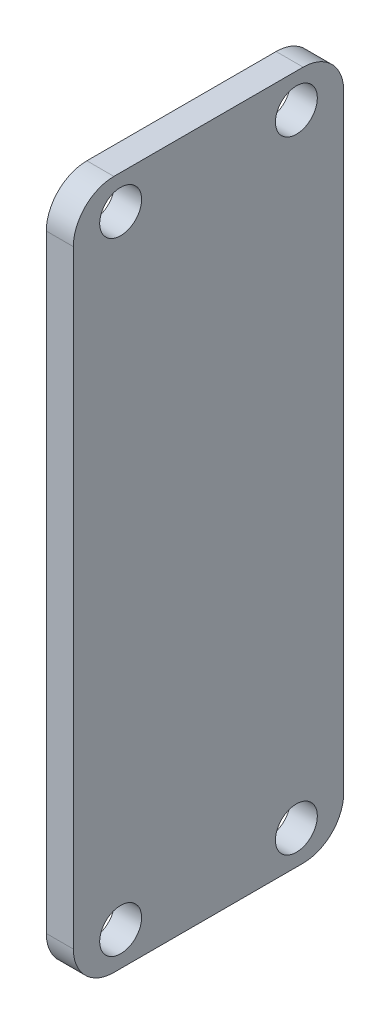
ISO-10303-21;
HEADER;
FILE_DESCRIPTION(('STEP AP214'),'2;1');
FILE_NAME('part.step','',(''),(''),'','','');
FILE_SCHEMA(('AUTOMOTIVE_DESIGN { 1 0 10303 214 1 1 1 1 }'));
ENDSEC;
DATA;
#1=APPLICATION_CONTEXT('core data for automotive mechanical design processes');
#2=APPLICATION_PROTOCOL_DEFINITION('international standard','automotive_design',2000,#1);
#3=PRODUCT_CONTEXT('',#1,'mechanical');
#4=PRODUCT('Part','Part','',(#3));
#5=PRODUCT_RELATED_PRODUCT_CATEGORY('part','',(#4));
#6=PRODUCT_DEFINITION_FORMATION('','',#4);
#7=PRODUCT_DEFINITION_CONTEXT('part definition',#1,'design');
#8=PRODUCT_DEFINITION('design','',#6,#7);
#9=PRODUCT_DEFINITION_SHAPE('','',#8);
#10=(LENGTH_UNIT() NAMED_UNIT(*) SI_UNIT(.MILLI.,.METRE.));
#11=(NAMED_UNIT(*) PLANE_ANGLE_UNIT() SI_UNIT($,.RADIAN.));
#12=(NAMED_UNIT(*) SI_UNIT($,.STERADIAN.) SOLID_ANGLE_UNIT());
#13=UNCERTAINTY_MEASURE_WITH_UNIT(LENGTH_MEASURE(1.E-05),#10,'distance_accuracy_value','');
#14=(GEOMETRIC_REPRESENTATION_CONTEXT(3) GLOBAL_UNCERTAINTY_ASSIGNED_CONTEXT((#13)) GLOBAL_UNIT_ASSIGNED_CONTEXT((#10,
#11,#12)) REPRESENTATION_CONTEXT('',''));
#15=CARTESIAN_POINT('',(0.,0.,0.));
#16=DIRECTION('',(0.,0.,1.));
#17=DIRECTION('',(1.,0.,0.));
#18=AXIS2_PLACEMENT_3D('',#15,#16,#17);
#19=CARTESIAN_POINT('',(0.,25.5,-9.5));
#20=DIRECTION('',(-1.,0.,0.));
#21=DIRECTION('',(0.,0.,1.));
#22=AXIS2_PLACEMENT_3D('',#19,#20,#21);
#23=PLANE('',#22);
#24=CARTESIAN_POINT('',(0.,-22.5,4.49999999999996));
#25=DIRECTION('',(-1.,0.,0.));
#26=DIRECTION('',(0.,0.,1.));
#27=AXIS2_PLACEMENT_3D('',#24,#25,#26);
#28=CIRCLE('',#27,3.);
#29=CARTESIAN_POINT('',(0.,-25.5,4.49999999999996));
#30=VERTEX_POINT('',#29);
#31=CARTESIAN_POINT('',(0.,-22.5,7.5));
#32=VERTEX_POINT('',#31);
#33=EDGE_CURVE('E118',#30,#32,#28,.T.);
#34=ORIENTED_EDGE('',*,*,#33,.T.);
#35=DIRECTION('',(0.,-1.,0.));
#36=VECTOR('',#35,1.);
#37=CARTESIAN_POINT('',(0.,25.5,7.50000000000001));
#38=LINE('',#37,#36);
#39=CARTESIAN_POINT('',(0.,22.5,7.5));
#40=VERTEX_POINT('',#39);
#41=EDGE_CURVE('E12',#40,#32,#38,.T.);
#42=ORIENTED_EDGE('',*,*,#41,.F.);
#43=CARTESIAN_POINT('',(0.,22.5,4.50000000000004));
#44=DIRECTION('',(-1.,0.,0.));
#45=DIRECTION('',(0.,0.,1.));
#46=AXIS2_PLACEMENT_3D('',#43,#44,#45);
#47=CIRCLE('',#46,3.);
#48=CARTESIAN_POINT('',(0.,25.5,4.50000000000004));
#49=VERTEX_POINT('',#48);
#50=EDGE_CURVE('E124',#40,#49,#47,.T.);
#51=ORIENTED_EDGE('',*,*,#50,.T.);
#52=DIRECTION('',(0.,0.,-1.));
#53=VECTOR('',#52,1.);
#54=CARTESIAN_POINT('',(0.,25.5,0.));
#55=LINE('',#54,#53);
#56=CARTESIAN_POINT('',(0.,25.5,-9.5));
#57=VERTEX_POINT('',#56);
#58=EDGE_CURVE('E152',#49,#57,#55,.T.);
#59=ORIENTED_EDGE('',*,*,#58,.T.);
#60=CARTESIAN_POINT('',(0.,22.5,-9.5));
#61=DIRECTION('',(-1.,0.,0.));
#62=DIRECTION('',(0.,0.,1.));
#63=AXIS2_PLACEMENT_3D('',#60,#61,#62);
#64=CIRCLE('',#63,3.);
#65=CARTESIAN_POINT('',(0.,22.5,-12.5));
#66=VERTEX_POINT('',#65);
#67=EDGE_CURVE('E128',#57,#66,#64,.T.);
#68=ORIENTED_EDGE('',*,*,#67,.T.);
#69=DIRECTION('',(0.,1.,0.));
#70=VECTOR('',#69,1.);
#71=CARTESIAN_POINT('',(0.,0.,-12.5));
#72=LINE('',#71,#70);
#73=CARTESIAN_POINT('',(0.,-22.5,-12.5));
#74=VERTEX_POINT('',#73);
#75=EDGE_CURVE('E159',#74,#66,#72,.T.);
#76=ORIENTED_EDGE('',*,*,#75,.F.);
#77=CARTESIAN_POINT('',(0.,-22.5,-9.5));
#78=DIRECTION('',(-1.,0.,0.));
#79=DIRECTION('',(0.,0.,1.));
#80=AXIS2_PLACEMENT_3D('',#77,#78,#79);
#81=CIRCLE('',#80,3.);
#82=CARTESIAN_POINT('',(0.,-25.5,-9.5));
#83=VERTEX_POINT('',#82);
#84=EDGE_CURVE('E123',#74,#83,#81,.T.);
#85=ORIENTED_EDGE('',*,*,#84,.T.);
#86=DIRECTION('',(0.,0.,-1.));
#87=VECTOR('',#86,1.);
#88=CARTESIAN_POINT('',(0.,-25.5,0.));
#89=LINE('',#88,#87);
#90=EDGE_CURVE('E49',#30,#83,#89,.T.);
#91=ORIENTED_EDGE('',*,*,#90,.F.);
#92=EDGE_LOOP('',(#34,#42,#51,#59,#68,#76,#85,#91));
#93=FACE_BOUND('',#92,.T.);
#94=CARTESIAN_POINT('',(0.,23.,4.00000000000001));
#95=DIRECTION('',(-1.,0.,0.));
#96=DIRECTION('',(0.,0.,1.));
#97=AXIS2_PLACEMENT_3D('',#94,#95,#96);
#98=CIRCLE('',#97,1.55);
#99=CARTESIAN_POINT('',(0.,23.,5.55000000000001));
#100=VERTEX_POINT('',#99);
#101=EDGE_CURVE('E164',#100,#100,#98,.F.);
#102=ORIENTED_EDGE('',*,*,#101,.T.);
#103=EDGE_LOOP('',(#102));
#104=FACE_BOUND('',#103,.T.);
#105=CARTESIAN_POINT('',(0.,23.,-9.));
#106=DIRECTION('',(-1.,0.,0.));
#107=DIRECTION('',(0.,0.,1.));
#108=AXIS2_PLACEMENT_3D('',#105,#106,#107);
#109=CIRCLE('',#108,1.55);
#110=CARTESIAN_POINT('',(0.,23.,-7.45));
#111=VERTEX_POINT('',#110);
#112=EDGE_CURVE('E156',#111,#111,#109,.F.);
#113=ORIENTED_EDGE('',*,*,#112,.T.);
#114=EDGE_LOOP('',(#113));
#115=FACE_BOUND('',#114,.T.);
#116=CARTESIAN_POINT('',(0.,-23.,-9.));
#117=DIRECTION('',(-1.,0.,0.));
#118=DIRECTION('',(0.,0.,1.));
#119=AXIS2_PLACEMENT_3D('',#116,#117,#118);
#120=CIRCLE('',#119,1.55);
#121=CARTESIAN_POINT('',(0.,-23.,-7.45));
#122=VERTEX_POINT('',#121);
#123=EDGE_CURVE('E151',#122,#122,#120,.F.);
#124=ORIENTED_EDGE('',*,*,#123,.T.);
#125=EDGE_LOOP('',(#124));
#126=FACE_BOUND('',#125,.T.);
#127=CARTESIAN_POINT('',(0.,-23.,4.));
#128=DIRECTION('',(-1.,0.,0.));
#129=DIRECTION('',(0.,0.,1.));
#130=AXIS2_PLACEMENT_3D('',#127,#128,#129);
#131=CIRCLE('',#130,1.55);
#132=CARTESIAN_POINT('',(0.,-23.,5.55));
#133=VERTEX_POINT('',#132);
#134=EDGE_CURVE('E155',#133,#133,#131,.F.);
#135=ORIENTED_EDGE('',*,*,#134,.T.);
#136=EDGE_LOOP('',(#135));
#137=FACE_BOUND('',#136,.T.);
#138=ADVANCED_FACE('F41',(#93,#104,#115,#126,#137),#23,.T.);
#139=CARTESIAN_POINT('',(-54.7813836992094,25.5,0.));
#140=DIRECTION('',(0.,-1.,0.));
#141=DIRECTION('',(0.,0.,-1.));
#142=AXIS2_PLACEMENT_3D('',#139,#140,#141);
#143=PLANE('',#142);
#144=DIRECTION('',(0.,0.,-1.));
#145=VECTOR('',#144,1.);
#146=CARTESIAN_POINT('',(2.,25.5,0.));
#147=LINE('',#146,#145);
#148=CARTESIAN_POINT('',(2.,25.5,4.50000000000004));
#149=VERTEX_POINT('',#148);
#150=CARTESIAN_POINT('',(2.,25.5,-9.5));
#151=VERTEX_POINT('',#150);
#152=EDGE_CURVE('E158',#149,#151,#147,.T.);
#153=ORIENTED_EDGE('',*,*,#152,.T.);
#154=DIRECTION('',(1.,0.,0.));
#155=VECTOR('',#154,1.);
#156=CARTESIAN_POINT('',(0.,25.5,-9.5));
#157=LINE('',#156,#155);
#158=EDGE_CURVE('E137',#151,#57,#157,.F.);
#159=ORIENTED_EDGE('',*,*,#158,.T.);
#160=ORIENTED_EDGE('',*,*,#58,.F.);
#161=DIRECTION('',(1.,0.,0.));
#162=VECTOR('',#161,1.);
#163=CARTESIAN_POINT('',(-54.7813836992094,25.5,4.50000000000004));
#164=LINE('',#163,#162);
#165=EDGE_CURVE('E139',#49,#149,#164,.T.);
#166=ORIENTED_EDGE('',*,*,#165,.T.);
#167=EDGE_LOOP('',(#153,#159,#160,#166));
#168=FACE_BOUND('',#167,.T.);
#169=ADVANCED_FACE('F213',(#168),#143,.F.);
#170=CARTESIAN_POINT('',(-16.,4.54999999999999,7.50000000000001));
#171=DIRECTION('',(0.,0.,-1.));
#172=DIRECTION('',(0.,1.,0.));
#173=AXIS2_PLACEMENT_3D('',#170,#171,#172);
#174=PLANE('',#173);
#175=ORIENTED_EDGE('',*,*,#41,.T.);
#176=DIRECTION('',(1.,0.,0.));
#177=VECTOR('',#176,1.);
#178=CARTESIAN_POINT('',(2.,-22.5,7.49999999999997));
#179=LINE('',#178,#177);
#180=CARTESIAN_POINT('',(2.,-22.5,7.5));
#181=VERTEX_POINT('',#180);
#182=EDGE_CURVE('E110',#32,#181,#179,.T.);
#183=ORIENTED_EDGE('',*,*,#182,.T.);
#184=DIRECTION('',(0.,-1.,0.));
#185=VECTOR('',#184,1.);
#186=CARTESIAN_POINT('',(2.,0.,7.5));
#187=LINE('',#186,#185);
#188=CARTESIAN_POINT('',(2.,22.5,7.5));
#189=VERTEX_POINT('',#188);
#190=EDGE_CURVE('E167',#189,#181,#187,.T.);
#191=ORIENTED_EDGE('',*,*,#190,.F.);
#192=DIRECTION('',(1.,0.,0.));
#193=VECTOR('',#192,1.);
#194=CARTESIAN_POINT('',(-16.,22.5,7.50000000000004));
#195=LINE('',#194,#193);
#196=EDGE_CURVE('E113',#189,#40,#195,.F.);
#197=ORIENTED_EDGE('',*,*,#196,.T.);
#198=EDGE_LOOP('',(#175,#183,#191,#197));
#199=FACE_BOUND('',#198,.T.);
#200=ADVANCED_FACE('F43',(#199),#174,.F.);
#201=CARTESIAN_POINT('',(-54.7813836992094,-25.5,0.));
#202=DIRECTION('',(0.,-1.,0.));
#203=DIRECTION('',(0.,0.,-1.));
#204=AXIS2_PLACEMENT_3D('',#201,#202,#203);
#205=PLANE('',#204);
#206=DIRECTION('',(0.,0.,-1.));
#207=VECTOR('',#206,1.);
#208=CARTESIAN_POINT('',(2.,-25.5,0.));
#209=LINE('',#208,#207);
#210=CARTESIAN_POINT('',(2.,-25.5,4.49999999999996));
#211=VERTEX_POINT('',#210);
#212=CARTESIAN_POINT('',(2.,-25.5,-9.5));
#213=VERTEX_POINT('',#212);
#214=EDGE_CURVE('E174',#211,#213,#209,.T.);
#215=ORIENTED_EDGE('',*,*,#214,.F.);
#216=DIRECTION('',(1.,0.,0.));
#217=VECTOR('',#216,1.);
#218=CARTESIAN_POINT('',(0.,-25.5,4.49999999999996));
#219=LINE('',#218,#217);
#220=EDGE_CURVE('E656',#211,#30,#219,.F.);
#221=ORIENTED_EDGE('',*,*,#220,.T.);
#222=ORIENTED_EDGE('',*,*,#90,.T.);
#223=DIRECTION('',(1.,0.,0.));
#224=VECTOR('',#223,1.);
#225=CARTESIAN_POINT('',(-54.7813836992094,-25.5,-9.5));
#226=LINE('',#225,#224);
#227=EDGE_CURVE('E131',#83,#213,#226,.T.);
#228=ORIENTED_EDGE('',*,*,#227,.T.);
#229=EDGE_LOOP('',(#215,#221,#222,#228));
#230=FACE_BOUND('',#229,.T.);
#231=ADVANCED_FACE('F198',(#230),#205,.T.);
#232=CARTESIAN_POINT('',(2.,0.,0.));
#233=DIRECTION('',(1.,0.,0.));
#234=DIRECTION('',(0.,0.,-1.));
#235=AXIS2_PLACEMENT_3D('',#232,#233,#234);
#236=PLANE('',#235);
#237=DIRECTION('',(0.,1.,0.));
#238=VECTOR('',#237,1.);
#239=CARTESIAN_POINT('',(2.,0.,-12.5));
#240=LINE('',#239,#238);
#241=CARTESIAN_POINT('',(2.,-22.5,-12.5));
#242=VERTEX_POINT('',#241);
#243=CARTESIAN_POINT('',(2.,22.5,-12.5));
#244=VERTEX_POINT('',#243);
#245=EDGE_CURVE('E176',#242,#244,#240,.T.);
#246=ORIENTED_EDGE('',*,*,#245,.T.);
#247=CARTESIAN_POINT('',(2.,22.5,-9.5));
#248=DIRECTION('',(1.,0.,0.));
#249=DIRECTION('',(0.,0.,-1.));
#250=AXIS2_PLACEMENT_3D('',#247,#248,#249);
#251=CIRCLE('',#250,3.);
#252=EDGE_CURVE('E64',#244,#151,#251,.T.);
#253=ORIENTED_EDGE('',*,*,#252,.T.);
#254=ORIENTED_EDGE('',*,*,#152,.F.);
#255=CARTESIAN_POINT('',(2.,22.5,4.50000000000004));
#256=DIRECTION('',(1.,0.,0.));
#257=DIRECTION('',(0.,0.,-1.));
#258=AXIS2_PLACEMENT_3D('',#255,#256,#257);
#259=CIRCLE('',#258,3.);
#260=EDGE_CURVE('E143',#149,#189,#259,.T.);
#261=ORIENTED_EDGE('',*,*,#260,.T.);
#262=ORIENTED_EDGE('',*,*,#190,.T.);
#263=CARTESIAN_POINT('',(2.,-22.5,4.49999999999996));
#264=DIRECTION('',(1.,0.,0.));
#265=DIRECTION('',(0.,0.,-1.));
#266=AXIS2_PLACEMENT_3D('',#263,#264,#265);
#267=CIRCLE('',#266,3.);
#268=EDGE_CURVE('E127',#181,#211,#267,.T.);
#269=ORIENTED_EDGE('',*,*,#268,.T.);
#270=ORIENTED_EDGE('',*,*,#214,.T.);
#271=CARTESIAN_POINT('',(2.,-22.5,-9.5));
#272=DIRECTION('',(1.,0.,0.));
#273=DIRECTION('',(0.,0.,-1.));
#274=AXIS2_PLACEMENT_3D('',#271,#272,#273);
#275=CIRCLE('',#274,3.);
#276=EDGE_CURVE('E56',#213,#242,#275,.T.);
#277=ORIENTED_EDGE('',*,*,#276,.T.);
#278=EDGE_LOOP('',(#246,#253,#254,#261,#262,#269,#270,#277));
#279=FACE_BOUND('',#278,.T.);
#280=CARTESIAN_POINT('',(2.,-23.,-9.));
#281=DIRECTION('',(1.,0.,0.));
#282=DIRECTION('',(0.,0.,-1.));
#283=AXIS2_PLACEMENT_3D('',#280,#281,#282);
#284=CIRCLE('',#283,1.55);
#285=CARTESIAN_POINT('',(2.,-23.,-10.55));
#286=VERTEX_POINT('',#285);
#287=EDGE_CURVE('E180',#286,#286,#284,.T.);
#288=ORIENTED_EDGE('',*,*,#287,.F.);
#289=EDGE_LOOP('',(#288));
#290=FACE_BOUND('',#289,.T.);
#291=CARTESIAN_POINT('',(2.,-23.,4.));
#292=DIRECTION('',(1.,0.,0.));
#293=DIRECTION('',(0.,0.,-1.));
#294=AXIS2_PLACEMENT_3D('',#291,#292,#293);
#295=CIRCLE('',#294,1.55);
#296=CARTESIAN_POINT('',(2.,-23.,2.45));
#297=VERTEX_POINT('',#296);
#298=EDGE_CURVE('E163',#297,#297,#295,.T.);
#299=ORIENTED_EDGE('',*,*,#298,.F.);
#300=EDGE_LOOP('',(#299));
#301=FACE_BOUND('',#300,.T.);
#302=CARTESIAN_POINT('',(2.,23.,4.00000000000001));
#303=DIRECTION('',(1.,0.,0.));
#304=DIRECTION('',(0.,0.,-1.));
#305=AXIS2_PLACEMENT_3D('',#302,#303,#304);
#306=CIRCLE('',#305,1.55);
#307=CARTESIAN_POINT('',(2.,23.,2.45000000000001));
#308=VERTEX_POINT('',#307);
#309=EDGE_CURVE('E184',#308,#308,#306,.T.);
#310=ORIENTED_EDGE('',*,*,#309,.F.);
#311=EDGE_LOOP('',(#310));
#312=FACE_BOUND('',#311,.T.);
#313=CARTESIAN_POINT('',(2.,23.,-9.));
#314=DIRECTION('',(1.,0.,0.));
#315=DIRECTION('',(0.,0.,-1.));
#316=AXIS2_PLACEMENT_3D('',#313,#314,#315);
#317=CIRCLE('',#316,1.55);
#318=CARTESIAN_POINT('',(2.,23.,-10.55));
#319=VERTEX_POINT('',#318);
#320=EDGE_CURVE('E162',#319,#319,#317,.T.);
#321=ORIENTED_EDGE('',*,*,#320,.F.);
#322=EDGE_LOOP('',(#321));
#323=FACE_BOUND('',#322,.T.);
#324=ADVANCED_FACE('F194',(#279,#290,#301,#312,#323),#236,.T.);
#325=CARTESIAN_POINT('',(-54.7813836992094,0.,-12.5));
#326=DIRECTION('',(0.,0.,-1.));
#327=DIRECTION('',(-1.,0.,0.));
#328=AXIS2_PLACEMENT_3D('',#325,#326,#327);
#329=PLANE('',#328);
#330=ORIENTED_EDGE('',*,*,#75,.T.);
#331=DIRECTION('',(1.,0.,0.));
#332=VECTOR('',#331,1.);
#333=CARTESIAN_POINT('',(2.,22.5,-12.5));
#334=LINE('',#333,#332);
#335=EDGE_CURVE('E147',#66,#244,#334,.T.);
#336=ORIENTED_EDGE('',*,*,#335,.T.);
#337=ORIENTED_EDGE('',*,*,#245,.F.);
#338=DIRECTION('',(1.,0.,0.));
#339=VECTOR('',#338,1.);
#340=CARTESIAN_POINT('',(-54.7813836992094,-22.5,-12.5));
#341=LINE('',#340,#339);
#342=EDGE_CURVE('E149',#242,#74,#341,.F.);
#343=ORIENTED_EDGE('',*,*,#342,.T.);
#344=EDGE_LOOP('',(#330,#336,#337,#343));
#345=FACE_BOUND('',#344,.T.);
#346=ADVANCED_FACE('F197',(#345),#329,.T.);
#347=CARTESIAN_POINT('',(-54.7813836992094,-22.5,-9.5));
#348=DIRECTION('',(1.,0.,0.));
#349=DIRECTION('',(0.,0.,-1.));
#350=AXIS2_PLACEMENT_3D('',#347,#348,#349);
#351=CYLINDRICAL_SURFACE('',#350,3.);
#352=ORIENTED_EDGE('',*,*,#84,.F.);
#353=ORIENTED_EDGE('',*,*,#342,.F.);
#354=ORIENTED_EDGE('',*,*,#276,.F.);
#355=ORIENTED_EDGE('',*,*,#227,.F.);
#356=EDGE_LOOP('',(#352,#353,#354,#355));
#357=FACE_BOUND('',#356,.T.);
#358=ADVANCED_FACE('F238',(#357),#351,.T.);
#359=CARTESIAN_POINT('',(-16.,-22.5,4.49999999999996));
#360=DIRECTION('',(-1.,0.,0.));
#361=DIRECTION('',(0.,0.,1.));
#362=AXIS2_PLACEMENT_3D('',#359,#360,#361);
#363=CYLINDRICAL_SURFACE('',#362,3.);
#364=ORIENTED_EDGE('',*,*,#33,.F.);
#365=ORIENTED_EDGE('',*,*,#220,.F.);
#366=ORIENTED_EDGE('',*,*,#268,.F.);
#367=ORIENTED_EDGE('',*,*,#182,.F.);
#368=EDGE_LOOP('',(#364,#365,#366,#367));
#369=FACE_BOUND('',#368,.T.);
#370=ADVANCED_FACE('F126',(#369),#363,.T.);
#371=CARTESIAN_POINT('',(-54.7813836992094,22.5,4.50000000000004));
#372=DIRECTION('',(1.,0.,0.));
#373=DIRECTION('',(0.,0.,-1.));
#374=AXIS2_PLACEMENT_3D('',#371,#372,#373);
#375=CYLINDRICAL_SURFACE('',#374,3.);
#376=ORIENTED_EDGE('',*,*,#50,.F.);
#377=ORIENTED_EDGE('',*,*,#196,.F.);
#378=ORIENTED_EDGE('',*,*,#260,.F.);
#379=ORIENTED_EDGE('',*,*,#165,.F.);
#380=EDGE_LOOP('',(#376,#377,#378,#379));
#381=FACE_BOUND('',#380,.T.);
#382=ADVANCED_FACE('F227',(#381),#375,.T.);
#383=CARTESIAN_POINT('',(-54.7813836992094,22.5,-9.5));
#384=DIRECTION('',(-1.,0.,0.));
#385=DIRECTION('',(0.,0.,1.));
#386=AXIS2_PLACEMENT_3D('',#383,#384,#385);
#387=CYLINDRICAL_SURFACE('',#386,3.);
#388=ORIENTED_EDGE('',*,*,#67,.F.);
#389=ORIENTED_EDGE('',*,*,#158,.F.);
#390=ORIENTED_EDGE('',*,*,#252,.F.);
#391=ORIENTED_EDGE('',*,*,#335,.F.);
#392=EDGE_LOOP('',(#388,#389,#390,#391));
#393=FACE_BOUND('',#392,.T.);
#394=ADVANCED_FACE('F219',(#393),#387,.T.);
#395=CARTESIAN_POINT('',(-54.7813836992094,-23.,4.));
#396=DIRECTION('',(1.,0.,0.));
#397=DIRECTION('',(0.,0.,-1.));
#398=AXIS2_PLACEMENT_3D('',#395,#396,#397);
#399=CYLINDRICAL_SURFACE('',#398,1.55);
#400=ORIENTED_EDGE('',*,*,#298,.T.);
#401=EDGE_LOOP('',(#400));
#402=FACE_BOUND('',#401,.T.);
#403=ORIENTED_EDGE('',*,*,#134,.F.);
#404=EDGE_LOOP('',(#403));
#405=FACE_BOUND('',#404,.T.);
#406=ADVANCED_FACE('F191',(#402,#405),#399,.F.);
#407=CARTESIAN_POINT('',(-54.7813836992094,-23.,-9.));
#408=DIRECTION('',(1.,0.,0.));
#409=DIRECTION('',(0.,0.,-1.));
#410=AXIS2_PLACEMENT_3D('',#407,#408,#409);
#411=CYLINDRICAL_SURFACE('',#410,1.55);
#412=ORIENTED_EDGE('',*,*,#287,.T.);
#413=EDGE_LOOP('',(#412));
#414=FACE_BOUND('',#413,.T.);
#415=ORIENTED_EDGE('',*,*,#123,.F.);
#416=EDGE_LOOP('',(#415));
#417=FACE_BOUND('',#416,.T.);
#418=ADVANCED_FACE('F218',(#414,#417),#411,.F.);
#419=CARTESIAN_POINT('',(-54.7813836992094,23.,4.00000000000001));
#420=DIRECTION('',(1.,0.,0.));
#421=DIRECTION('',(0.,0.,-1.));
#422=AXIS2_PLACEMENT_3D('',#419,#420,#421);
#423=CYLINDRICAL_SURFACE('',#422,1.55);
#424=ORIENTED_EDGE('',*,*,#309,.T.);
#425=EDGE_LOOP('',(#424));
#426=FACE_BOUND('',#425,.T.);
#427=ORIENTED_EDGE('',*,*,#101,.F.);
#428=EDGE_LOOP('',(#427));
#429=FACE_BOUND('',#428,.T.);
#430=ADVANCED_FACE('F207',(#426,#429),#423,.F.);
#431=CARTESIAN_POINT('',(-54.7813836992094,23.,-9.));
#432=DIRECTION('',(1.,0.,0.));
#433=DIRECTION('',(0.,0.,-1.));
#434=AXIS2_PLACEMENT_3D('',#431,#432,#433);
#435=CYLINDRICAL_SURFACE('',#434,1.55);
#436=ORIENTED_EDGE('',*,*,#320,.T.);
#437=EDGE_LOOP('',(#436));
#438=FACE_BOUND('',#437,.T.);
#439=ORIENTED_EDGE('',*,*,#112,.F.);
#440=EDGE_LOOP('',(#439));
#441=FACE_BOUND('',#440,.T.);
#442=ADVANCED_FACE('F204',(#438,#441),#435,.F.);
#443=CLOSED_SHELL('',(#138,#169,#200,#231,#324,#346,#358,#370,#382,#394,#406,#418,#430,#442));
#444=MANIFOLD_SOLID_BREP('B2',#443);
#445=ADVANCED_BREP_SHAPE_REPRESENTATION('',(#18,#444),#14);
#446=SHAPE_DEFINITION_REPRESENTATION(#9,#445);
ENDSEC;
END-ISO-10303-21;
